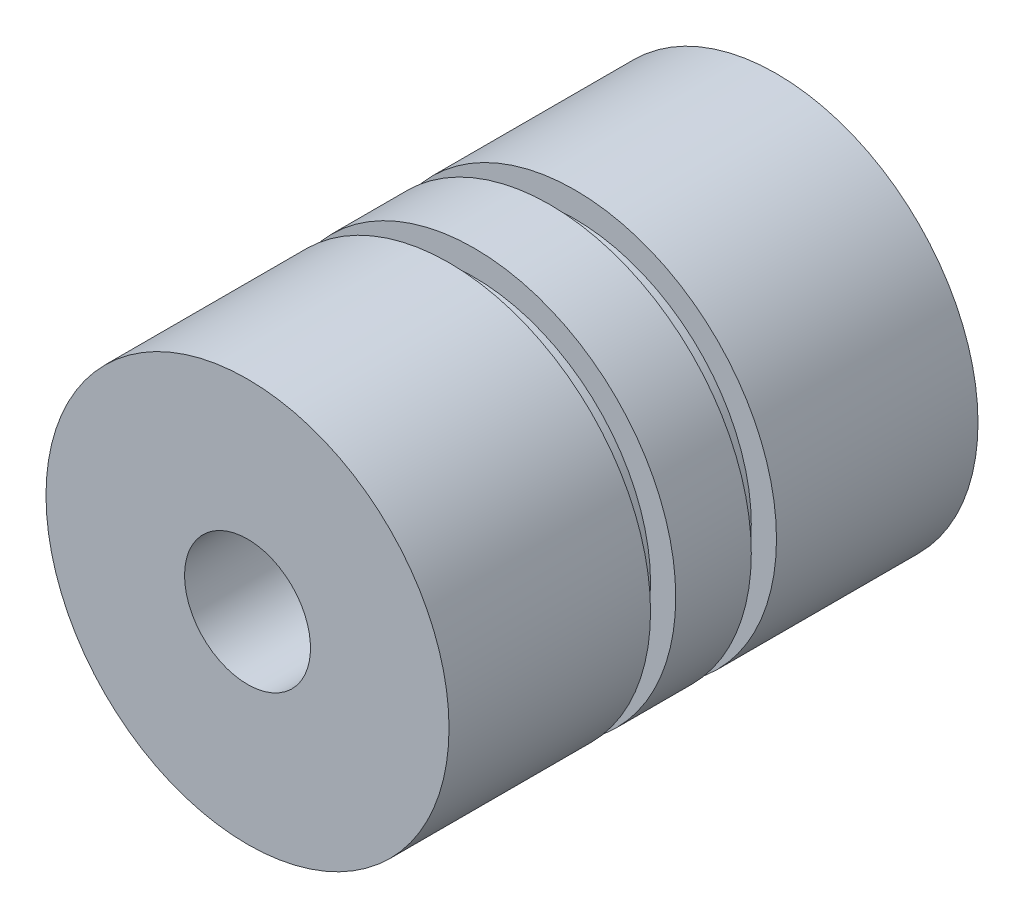
ISO-10303-21;
HEADER;
FILE_DESCRIPTION(('STEP AP214'),'2;1');
FILE_NAME('part.step','',(''),(''),'','','');
FILE_SCHEMA(('AUTOMOTIVE_DESIGN { 1 0 10303 214 1 1 1 1 }'));
ENDSEC;
DATA;
#1=APPLICATION_CONTEXT('core data for automotive mechanical design processes');
#2=APPLICATION_PROTOCOL_DEFINITION('international standard','automotive_design',2000,#1);
#3=PRODUCT_CONTEXT('',#1,'mechanical');
#4=PRODUCT('Part','Part','',(#3));
#5=PRODUCT_RELATED_PRODUCT_CATEGORY('part','',(#4));
#6=PRODUCT_DEFINITION_FORMATION('','',#4);
#7=PRODUCT_DEFINITION_CONTEXT('part definition',#1,'design');
#8=PRODUCT_DEFINITION('design','',#6,#7);
#9=PRODUCT_DEFINITION_SHAPE('','',#8);
#10=(LENGTH_UNIT() NAMED_UNIT(*) SI_UNIT(.MILLI.,.METRE.));
#11=(NAMED_UNIT(*) PLANE_ANGLE_UNIT() SI_UNIT($,.RADIAN.));
#12=(NAMED_UNIT(*) SI_UNIT($,.STERADIAN.) SOLID_ANGLE_UNIT());
#13=UNCERTAINTY_MEASURE_WITH_UNIT(LENGTH_MEASURE(1.E-05),#10,'distance_accuracy_value','');
#14=(GEOMETRIC_REPRESENTATION_CONTEXT(3) GLOBAL_UNCERTAINTY_ASSIGNED_CONTEXT((#13)) GLOBAL_UNIT_ASSIGNED_CONTEXT((#10,
#11,#12)) REPRESENTATION_CONTEXT('',''));
#15=CARTESIAN_POINT('',(0.,0.,0.));
#16=DIRECTION('',(0.,0.,1.));
#17=DIRECTION('',(1.,0.,0.));
#18=AXIS2_PLACEMENT_3D('',#15,#16,#17);
#19=CARTESIAN_POINT('',(0.,0.,21.));
#20=DIRECTION('',(0.,0.,-1.));
#21=DIRECTION('',(-1.,0.,0.));
#22=AXIS2_PLACEMENT_3D('',#19,#20,#21);
#23=CYLINDRICAL_SURFACE('',#22,16.);
#24=CARTESIAN_POINT('',(0.,0.,-21.));
#25=DIRECTION('',(0.,0.,1.));
#26=DIRECTION('',(1.,0.,0.));
#27=AXIS2_PLACEMENT_3D('',#24,#25,#26);
#28=CIRCLE('',#27,16.);
#29=CARTESIAN_POINT('',(-16.,0.,-21.));
#30=VERTEX_POINT('',#29);
#31=EDGE_CURVE('E39',#30,#30,#28,.T.);
#32=CARTESIAN_POINT('',(0.,0.,-5.));
#33=DIRECTION('',(0.,0.,1.));
#34=DIRECTION('',(1.,0.,0.));
#35=AXIS2_PLACEMENT_3D('',#32,#33,#34);
#36=CIRCLE('',#35,16.);
#37=CARTESIAN_POINT('',(-16.,0.,-5.));
#38=VERTEX_POINT('',#37);
#39=EDGE_CURVE('E64',#38,#38,#36,.T.);
#40=CARTESIAN_POINT('',(-16.,0.,-21.));
#41=CARTESIAN_POINT('',(-16.,0.,-20.8333333333333));
#42=CARTESIAN_POINT('',(-16.,0.,-20.6666666666667));
#43=CARTESIAN_POINT('',(-16.,0.,-20.3333333333333));
#44=CARTESIAN_POINT('',(-16.,0.,-20.1666666666667));
#45=CARTESIAN_POINT('',(-16.,0.,-19.8333333333333));
#46=CARTESIAN_POINT('',(-16.,0.,-19.6666666666667));
#47=CARTESIAN_POINT('',(-16.,0.,-19.3333333333333));
#48=CARTESIAN_POINT('',(-16.,0.,-19.1666666666667));
#49=CARTESIAN_POINT('',(-16.,0.,-18.8333333333333));
#50=CARTESIAN_POINT('',(-16.,0.,-18.6666666666667));
#51=CARTESIAN_POINT('',(-16.,0.,-18.3333333333333));
#52=CARTESIAN_POINT('',(-16.,0.,-18.1666666666667));
#53=CARTESIAN_POINT('',(-16.,0.,-17.8333333333333));
#54=CARTESIAN_POINT('',(-16.,0.,-17.6666666666667));
#55=CARTESIAN_POINT('',(-16.,0.,-17.3333333333333));
#56=CARTESIAN_POINT('',(-16.,0.,-17.1666666666667));
#57=CARTESIAN_POINT('',(-16.,0.,-16.8333333333333));
#58=CARTESIAN_POINT('',(-16.,0.,-16.6666666666667));
#59=CARTESIAN_POINT('',(-16.,0.,-16.3333333333333));
#60=CARTESIAN_POINT('',(-16.,0.,-16.1666666666667));
#61=CARTESIAN_POINT('',(-16.,0.,-15.8333333333333));
#62=CARTESIAN_POINT('',(-16.,0.,-15.6666666666667));
#63=CARTESIAN_POINT('',(-16.,0.,-15.3333333333333));
#64=CARTESIAN_POINT('',(-16.,0.,-15.1666666666667));
#65=CARTESIAN_POINT('',(-16.,0.,-14.8333333333333));
#66=CARTESIAN_POINT('',(-16.,0.,-14.6666666666667));
#67=CARTESIAN_POINT('',(-16.,0.,-14.3333333333333));
#68=CARTESIAN_POINT('',(-16.,0.,-14.1666666666667));
#69=CARTESIAN_POINT('',(-16.,0.,-13.8333333333333));
#70=CARTESIAN_POINT('',(-16.,0.,-13.6666666666667));
#71=CARTESIAN_POINT('',(-16.,0.,-13.3333333333333));
#72=CARTESIAN_POINT('',(-16.,0.,-13.1666666666667));
#73=CARTESIAN_POINT('',(-16.,0.,-12.8333333333333));
#74=CARTESIAN_POINT('',(-16.,0.,-12.6666666666667));
#75=CARTESIAN_POINT('',(-16.,0.,-12.3333333333333));
#76=CARTESIAN_POINT('',(-16.,0.,-12.1666666666667));
#77=CARTESIAN_POINT('',(-16.,0.,-11.8333333333333));
#78=CARTESIAN_POINT('',(-16.,0.,-11.6666666666667));
#79=CARTESIAN_POINT('',(-16.,0.,-11.3333333333333));
#80=CARTESIAN_POINT('',(-16.,0.,-11.1666666666667));
#81=CARTESIAN_POINT('',(-16.,0.,-10.8333333333333));
#82=CARTESIAN_POINT('',(-16.,0.,-10.6666666666667));
#83=CARTESIAN_POINT('',(-16.,0.,-10.3333333333333));
#84=CARTESIAN_POINT('',(-16.,0.,-10.1666666666667));
#85=CARTESIAN_POINT('',(-16.,0.,-9.83333333333333));
#86=CARTESIAN_POINT('',(-16.,0.,-9.66666666666667));
#87=CARTESIAN_POINT('',(-16.,0.,-9.33333333333333));
#88=CARTESIAN_POINT('',(-16.,0.,-9.16666666666667));
#89=CARTESIAN_POINT('',(-16.,0.,-8.83333333333333));
#90=CARTESIAN_POINT('',(-16.,0.,-8.66666666666667));
#91=CARTESIAN_POINT('',(-16.,0.,-8.33333333333333));
#92=CARTESIAN_POINT('',(-16.,0.,-8.16666666666667));
#93=CARTESIAN_POINT('',(-16.,0.,-7.83333333333333));
#94=CARTESIAN_POINT('',(-16.,0.,-7.66666666666667));
#95=CARTESIAN_POINT('',(-16.,0.,-7.33333333333333));
#96=CARTESIAN_POINT('',(-16.,0.,-7.16666666666667));
#97=CARTESIAN_POINT('',(-16.,0.,-6.83333333333333));
#98=CARTESIAN_POINT('',(-16.,0.,-6.66666666666667));
#99=CARTESIAN_POINT('',(-16.,0.,-6.33333333333333));
#100=CARTESIAN_POINT('',(-16.,0.,-6.16666666666667));
#101=CARTESIAN_POINT('',(-16.,0.,-5.83333333333333));
#102=CARTESIAN_POINT('',(-16.,0.,-5.66666666666666));
#103=CARTESIAN_POINT('',(-16.,0.,-5.33333333333333));
#104=CARTESIAN_POINT('',(-16.,0.,-5.16666666666666));
#105=CARTESIAN_POINT('',(-16.,0.,-5.));
#106=B_SPLINE_CURVE_WITH_KNOTS('',3,(#40,#41,#42,#43,#44,#45,#46,#47,#48,#49,#50,#51,#52,#53,
#54,#55,#56,#57,#58,#59,#60,#61,#62,#63,#64,#65,#66,#67,#68,#69,#70,#71,#72,#73,#74,#75,#76,#77,
#78,#79,#80,#81,#82,#83,#84,#85,#86,#87,#88,#89,#90,#91,#92,#93,#94,#95,#96,#97,#98,#99,#100,
#101,#102,#103,#104,#105),.UNSPECIFIED.,.F.,.F.,(4,2,2,2,2,2,2,2,2,2,2,2,2,2,2,2,2,2,2,2,2,2,2,
2,2,2,2,2,2,2,2,2,4),(0.,0.5,1.,1.5,2.,2.5,3.,3.5,4.,4.5,5.,5.50000000000001,6.00000000000001,
6.50000000000001,7.00000000000001,7.50000000000001,8.00000000000001,8.50000000000001,
9.00000000000001,9.50000000000001,10.,10.5,11.,11.5,12.,12.5,13.,13.5,14.,14.5,15.,15.5,16.),.UNSPECIFIED.);
#107=EDGE_CURVE('BSEAM31',#30,#38,#106,.T.);
#108=ORIENTED_EDGE('',*,*,#31,.T.);
#109=ORIENTED_EDGE('',*,*,#39,.F.);
#110=ORIENTED_EDGE('',*,*,#107,.T.);
#111=ORIENTED_EDGE('',*,*,#107,.F.);
#112=EDGE_LOOP('',(#108,#110,#109,#111));
#113=FACE_BOUND('',#112,.T.);
#114=ADVANCED_FACE('F31',(#113),#23,.T.);
#115=CARTESIAN_POINT('',(0.,0.,-3.));
#116=DIRECTION('',(0.,0.,1.));
#117=DIRECTION('',(1.,0.,0.));
#118=AXIS2_PLACEMENT_3D('',#115,#116,#117);
#119=CIRCLE('',#118,16.);
#120=CARTESIAN_POINT('',(-16.,0.,-3.));
#121=VERTEX_POINT('',#120);
#122=EDGE_CURVE('E67',#121,#121,#119,.T.);
#123=CARTESIAN_POINT('',(0.,0.,3.));
#124=DIRECTION('',(0.,0.,1.));
#125=DIRECTION('',(1.,0.,0.));
#126=AXIS2_PLACEMENT_3D('',#123,#124,#125);
#127=CIRCLE('',#126,16.);
#128=CARTESIAN_POINT('',(-16.,0.,3.));
#129=VERTEX_POINT('',#128);
#130=EDGE_CURVE('E52',#129,#129,#127,.T.);
#131=CARTESIAN_POINT('',(-16.,0.,-3.));
#132=CARTESIAN_POINT('',(-16.,0.,-2.9375));
#133=CARTESIAN_POINT('',(-16.,0.,-2.875));
#134=CARTESIAN_POINT('',(-16.,0.,-2.75));
#135=CARTESIAN_POINT('',(-16.,0.,-2.6875));
#136=CARTESIAN_POINT('',(-16.,0.,-2.5625));
#137=CARTESIAN_POINT('',(-16.,0.,-2.5));
#138=CARTESIAN_POINT('',(-16.,0.,-2.375));
#139=CARTESIAN_POINT('',(-16.,0.,-2.3125));
#140=CARTESIAN_POINT('',(-16.,0.,-2.1875));
#141=CARTESIAN_POINT('',(-16.,0.,-2.125));
#142=CARTESIAN_POINT('',(-16.,0.,-2.));
#143=CARTESIAN_POINT('',(-16.,0.,-1.9375));
#144=CARTESIAN_POINT('',(-16.,0.,-1.8125));
#145=CARTESIAN_POINT('',(-16.,0.,-1.75));
#146=CARTESIAN_POINT('',(-16.,0.,-1.625));
#147=CARTESIAN_POINT('',(-16.,0.,-1.5625));
#148=CARTESIAN_POINT('',(-16.,0.,-1.4375));
#149=CARTESIAN_POINT('',(-16.,0.,-1.375));
#150=CARTESIAN_POINT('',(-16.,0.,-1.25));
#151=CARTESIAN_POINT('',(-16.,0.,-1.1875));
#152=CARTESIAN_POINT('',(-16.,0.,-1.0625));
#153=CARTESIAN_POINT('',(-16.,0.,-1.));
#154=CARTESIAN_POINT('',(-16.,0.,-0.875000000000001));
#155=CARTESIAN_POINT('',(-16.,0.,-0.812500000000001));
#156=CARTESIAN_POINT('',(-16.,0.,-0.687500000000001));
#157=CARTESIAN_POINT('',(-16.,0.,-0.625000000000001));
#158=CARTESIAN_POINT('',(-16.,0.,-0.5));
#159=CARTESIAN_POINT('',(-16.,0.,-0.4375));
#160=CARTESIAN_POINT('',(-16.,0.,-0.3125));
#161=CARTESIAN_POINT('',(-16.,0.,-0.25));
#162=CARTESIAN_POINT('',(-16.,0.,-0.125));
#163=CARTESIAN_POINT('',(-16.,0.,-0.0625000000000001));
#164=CARTESIAN_POINT('',(-16.,0.,0.0625000000000001));
#165=CARTESIAN_POINT('',(-16.,0.,0.125));
#166=CARTESIAN_POINT('',(-16.,0.,0.25));
#167=CARTESIAN_POINT('',(-16.,0.,0.3125));
#168=CARTESIAN_POINT('',(-16.,0.,0.4375));
#169=CARTESIAN_POINT('',(-16.,0.,0.5));
#170=CARTESIAN_POINT('',(-16.,0.,0.625000000000001));
#171=CARTESIAN_POINT('',(-16.,0.,0.687500000000001));
#172=CARTESIAN_POINT('',(-16.,0.,0.812500000000001));
#173=CARTESIAN_POINT('',(-16.,0.,0.875000000000001));
#174=CARTESIAN_POINT('',(-16.,0.,1.));
#175=CARTESIAN_POINT('',(-16.,0.,1.0625));
#176=CARTESIAN_POINT('',(-16.,0.,1.1875));
#177=CARTESIAN_POINT('',(-16.,0.,1.25));
#178=CARTESIAN_POINT('',(-16.,0.,1.375));
#179=CARTESIAN_POINT('',(-16.,0.,1.4375));
#180=CARTESIAN_POINT('',(-16.,0.,1.5625));
#181=CARTESIAN_POINT('',(-16.,0.,1.625));
#182=CARTESIAN_POINT('',(-16.,0.,1.75));
#183=CARTESIAN_POINT('',(-16.,0.,1.8125));
#184=CARTESIAN_POINT('',(-16.,0.,1.9375));
#185=CARTESIAN_POINT('',(-16.,0.,2.));
#186=CARTESIAN_POINT('',(-16.,0.,2.125));
#187=CARTESIAN_POINT('',(-16.,0.,2.1875));
#188=CARTESIAN_POINT('',(-16.,0.,2.3125));
#189=CARTESIAN_POINT('',(-16.,0.,2.375));
#190=CARTESIAN_POINT('',(-16.,0.,2.5));
#191=CARTESIAN_POINT('',(-16.,0.,2.5625));
#192=CARTESIAN_POINT('',(-16.,0.,2.6875));
#193=CARTESIAN_POINT('',(-16.,0.,2.75));
#194=CARTESIAN_POINT('',(-16.,0.,2.875));
#195=CARTESIAN_POINT('',(-16.,0.,2.9375));
#196=CARTESIAN_POINT('',(-16.,0.,3.));
#197=B_SPLINE_CURVE_WITH_KNOTS('',3,(#131,#132,#133,#134,#135,#136,#137,#138,#139,#140,#141,
#142,#143,#144,#145,#146,#147,#148,#149,#150,#151,#152,#153,#154,#155,#156,#157,#158,#159,#160,
#161,#162,#163,#164,#165,#166,#167,#168,#169,#170,#171,#172,#173,#174,#175,#176,#177,#178,#179,
#180,#181,#182,#183,#184,#185,#186,#187,#188,#189,#190,#191,#192,#193,#194,#195,#196),
.UNSPECIFIED.,.F.,.F.,(4,2,2,2,2,2,2,2,2,2,2,2,2,2,2,2,2,2,2,2,2,2,2,2,2,2,2,2,2,2,2,2,4),(0.,
0.1875,0.375,0.5625,0.750000000000001,0.937500000000001,1.125,1.3125,1.5,1.6875,1.875,2.0625,
2.25,2.4375,2.625,2.8125,3.,3.1875,3.375,3.5625,3.75,3.9375,4.125,4.3125,4.5,4.6875,4.875,
5.0625,5.25,5.4375,5.62500000000001,5.81250000000001,6.00000000000001),.UNSPECIFIED.);
#198=EDGE_CURVE('BSEAM91',#121,#129,#197,.T.);
#199=ORIENTED_EDGE('',*,*,#122,.T.);
#200=ORIENTED_EDGE('',*,*,#130,.F.);
#201=ORIENTED_EDGE('',*,*,#198,.T.);
#202=ORIENTED_EDGE('',*,*,#198,.F.);
#203=EDGE_LOOP('',(#199,#201,#200,#202));
#204=FACE_BOUND('',#203,.T.);
#205=ADVANCED_FACE('F91',(#204),#23,.T.);
#206=CARTESIAN_POINT('',(0.,0.,21.));
#207=DIRECTION('',(0.,0.,-1.));
#208=DIRECTION('',(-1.,0.,0.));
#209=AXIS2_PLACEMENT_3D('',#206,#207,#208);
#210=CYLINDRICAL_SURFACE('',#209,5.);
#211=CARTESIAN_POINT('',(0.,0.,21.));
#212=DIRECTION('',(0.,0.,1.));
#213=DIRECTION('',(1.,0.,0.));
#214=AXIS2_PLACEMENT_3D('',#211,#212,#213);
#215=CIRCLE('',#214,5.);
#216=CARTESIAN_POINT('',(-5.,0.,21.));
#217=VERTEX_POINT('',#216);
#218=EDGE_CURVE('E44',#217,#217,#215,.T.);
#219=CARTESIAN_POINT('',(0.,0.,9.00000000000001));
#220=DIRECTION('',(0.,0.,-1.));
#221=DIRECTION('',(-1.,0.,0.));
#222=AXIS2_PLACEMENT_3D('',#219,#220,#221);
#223=CIRCLE('',#222,5.);
#224=CARTESIAN_POINT('',(-5.,0.,9.00000000000002));
#225=VERTEX_POINT('',#224);
#226=EDGE_CURVE('E35',#225,#225,#223,.T.);
#227=CARTESIAN_POINT('',(-5.,0.,21.));
#228=CARTESIAN_POINT('',(-5.,0.,20.875));
#229=CARTESIAN_POINT('',(-5.,0.,20.75));
#230=CARTESIAN_POINT('',(-5.,0.,20.5));
#231=CARTESIAN_POINT('',(-5.,0.,20.375));
#232=CARTESIAN_POINT('',(-5.,0.,20.125));
#233=CARTESIAN_POINT('',(-5.,0.,20.));
#234=CARTESIAN_POINT('',(-5.,0.,19.75));
#235=CARTESIAN_POINT('',(-5.,0.,19.625));
#236=CARTESIAN_POINT('',(-5.,0.,19.375));
#237=CARTESIAN_POINT('',(-5.,0.,19.25));
#238=CARTESIAN_POINT('',(-5.,0.,19.));
#239=CARTESIAN_POINT('',(-5.,0.,18.875));
#240=CARTESIAN_POINT('',(-5.,0.,18.625));
#241=CARTESIAN_POINT('',(-5.,0.,18.5));
#242=CARTESIAN_POINT('',(-5.,0.,18.25));
#243=CARTESIAN_POINT('',(-5.,0.,18.125));
#244=CARTESIAN_POINT('',(-5.,0.,17.875));
#245=CARTESIAN_POINT('',(-5.,0.,17.75));
#246=CARTESIAN_POINT('',(-5.,0.,17.5));
#247=CARTESIAN_POINT('',(-5.,0.,17.375));
#248=CARTESIAN_POINT('',(-5.,0.,17.125));
#249=CARTESIAN_POINT('',(-5.,0.,17.));
#250=CARTESIAN_POINT('',(-5.,0.,16.75));
#251=CARTESIAN_POINT('',(-5.,0.,16.625));
#252=CARTESIAN_POINT('',(-5.,0.,16.375));
#253=CARTESIAN_POINT('',(-5.,0.,16.25));
#254=CARTESIAN_POINT('',(-5.,0.,16.));
#255=CARTESIAN_POINT('',(-5.,0.,15.875));
#256=CARTESIAN_POINT('',(-5.,0.,15.625));
#257=CARTESIAN_POINT('',(-5.,0.,15.5));
#258=CARTESIAN_POINT('',(-5.,0.,15.25));
#259=CARTESIAN_POINT('',(-5.,0.,15.125));
#260=CARTESIAN_POINT('',(-5.,0.,14.875));
#261=CARTESIAN_POINT('',(-5.,0.,14.75));
#262=CARTESIAN_POINT('',(-5.,0.,14.5));
#263=CARTESIAN_POINT('',(-5.,0.,14.375));
#264=CARTESIAN_POINT('',(-5.,0.,14.125));
#265=CARTESIAN_POINT('',(-5.,0.,14.));
#266=CARTESIAN_POINT('',(-5.,0.,13.75));
#267=CARTESIAN_POINT('',(-5.,0.,13.625));
#268=CARTESIAN_POINT('',(-5.,0.,13.375));
#269=CARTESIAN_POINT('',(-5.,0.,13.25));
#270=CARTESIAN_POINT('',(-5.,0.,13.));
#271=CARTESIAN_POINT('',(-5.,0.,12.875));
#272=CARTESIAN_POINT('',(-5.,0.,12.625));
#273=CARTESIAN_POINT('',(-5.,0.,12.5));
#274=CARTESIAN_POINT('',(-5.,0.,12.25));
#275=CARTESIAN_POINT('',(-5.,0.,12.125));
#276=CARTESIAN_POINT('',(-5.,0.,11.875));
#277=CARTESIAN_POINT('',(-5.,0.,11.75));
#278=CARTESIAN_POINT('',(-5.,0.,11.5));
#279=CARTESIAN_POINT('',(-5.,0.,11.375));
#280=CARTESIAN_POINT('',(-5.,0.,11.125));
#281=CARTESIAN_POINT('',(-5.,0.,11.));
#282=CARTESIAN_POINT('',(-5.,0.,10.75));
#283=CARTESIAN_POINT('',(-5.,0.,10.625));
#284=CARTESIAN_POINT('',(-5.,0.,10.375));
#285=CARTESIAN_POINT('',(-5.,0.,10.25));
#286=CARTESIAN_POINT('',(-5.,0.,10.));
#287=CARTESIAN_POINT('',(-5.,0.,9.87500000000002));
#288=CARTESIAN_POINT('',(-5.,0.,9.62500000000002));
#289=CARTESIAN_POINT('',(-5.,0.,9.50000000000002));
#290=CARTESIAN_POINT('',(-5.,0.,9.25000000000002));
#291=CARTESIAN_POINT('',(-5.,0.,9.12500000000002));
#292=CARTESIAN_POINT('',(-5.,0.,9.00000000000002));
#293=B_SPLINE_CURVE_WITH_KNOTS('',3,(#227,#228,#229,#230,#231,#232,#233,#234,#235,#236,#237,
#238,#239,#240,#241,#242,#243,#244,#245,#246,#247,#248,#249,#250,#251,#252,#253,#254,#255,#256,
#257,#258,#259,#260,#261,#262,#263,#264,#265,#266,#267,#268,#269,#270,#271,#272,#273,#274,#275,
#276,#277,#278,#279,#280,#281,#282,#283,#284,#285,#286,#287,#288,#289,#290,#291,#292),
.UNSPECIFIED.,.F.,.F.,(4,2,2,2,2,2,2,2,2,2,2,2,2,2,2,2,2,2,2,2,2,2,2,2,2,2,2,2,2,2,2,2,4),(0.,
0.374999999999997,0.749999999999997,1.125,1.49999999999999,1.87499999999999,2.25,2.625,3.,
3.37499999999999,3.74999999999999,4.12499999999999,4.49999999999999,4.87499999999999,
5.24999999999999,5.62499999999999,5.99999999999999,6.37499999999999,6.74999999999999,
7.12499999999999,7.49999999999999,7.87499999999999,8.24999999999999,8.62499999999999,
8.99999999999999,9.37499999999998,9.74999999999998,10.125,10.5,10.875,11.25,11.625,12.),.UNSPECIFIED.);
#294=EDGE_CURVE('BSEAM96',#217,#225,#293,.T.);
#295=ORIENTED_EDGE('',*,*,#218,.T.);
#296=ORIENTED_EDGE('',*,*,#226,.T.);
#297=ORIENTED_EDGE('',*,*,#294,.T.);
#298=ORIENTED_EDGE('',*,*,#294,.F.);
#299=EDGE_LOOP('',(#295,#297,#296,#298));
#300=FACE_BOUND('',#299,.T.);
#301=ADVANCED_FACE('F96',(#300),#210,.F.);
#302=CARTESIAN_POINT('',(0.,0.,21.));
#303=DIRECTION('',(0.,0.,1.));
#304=DIRECTION('',(1.,0.,0.));
#305=AXIS2_PLACEMENT_3D('',#302,#303,#304);
#306=PLANE('',#305);
#307=CARTESIAN_POINT('',(0.,0.,21.));
#308=DIRECTION('',(0.,0.,1.));
#309=DIRECTION('',(1.,0.,0.));
#310=AXIS2_PLACEMENT_3D('',#307,#308,#309);
#311=CIRCLE('',#310,16.);
#312=CARTESIAN_POINT('',(-16.,0.,21.));
#313=VERTEX_POINT('',#312);
#314=EDGE_CURVE('E10',#313,#313,#311,.T.);
#315=ORIENTED_EDGE('',*,*,#314,.T.);
#316=EDGE_LOOP('',(#315));
#317=FACE_BOUND('',#316,.T.);
#318=ORIENTED_EDGE('',*,*,#218,.F.);
#319=EDGE_LOOP('',(#318));
#320=FACE_BOUND('',#319,.T.);
#321=ADVANCED_FACE('F109',(#317,#320),#306,.T.);
#322=CARTESIAN_POINT('',(0.,0.,-21.));
#323=DIRECTION('',(0.,0.,1.));
#324=DIRECTION('',(1.,0.,0.));
#325=AXIS2_PLACEMENT_3D('',#322,#323,#324);
#326=PLANE('',#325);
#327=CARTESIAN_POINT('',(0.,0.,-21.));
#328=DIRECTION('',(0.,0.,-1.));
#329=DIRECTION('',(-1.,0.,0.));
#330=AXIS2_PLACEMENT_3D('',#327,#328,#329);
#331=CIRCLE('',#330,7.);
#332=CARTESIAN_POINT('',(-7.,0.,-21.));
#333=VERTEX_POINT('',#332);
#334=EDGE_CURVE('E48',#333,#333,#331,.T.);
#335=ORIENTED_EDGE('',*,*,#334,.F.);
#336=EDGE_LOOP('',(#335));
#337=FACE_BOUND('',#336,.T.);
#338=ORIENTED_EDGE('',*,*,#31,.F.);
#339=EDGE_LOOP('',(#338));
#340=FACE_BOUND('',#339,.T.);
#341=ADVANCED_FACE('F100',(#337,#340),#326,.F.);
#342=CARTESIAN_POINT('',(0.,0.,5.));
#343=DIRECTION('',(0.,0.,1.));
#344=DIRECTION('',(1.,0.,0.));
#345=AXIS2_PLACEMENT_3D('',#342,#343,#344);
#346=CIRCLE('',#345,16.);
#347=CARTESIAN_POINT('',(-16.,0.,5.));
#348=VERTEX_POINT('',#347);
#349=EDGE_CURVE('E55',#348,#348,#346,.T.);
#350=CARTESIAN_POINT('',(-16.,0.,5.));
#351=CARTESIAN_POINT('',(-16.,0.,5.16666666666666));
#352=CARTESIAN_POINT('',(-16.,0.,5.33333333333333));
#353=CARTESIAN_POINT('',(-16.,0.,5.66666666666666));
#354=CARTESIAN_POINT('',(-16.,0.,5.83333333333333));
#355=CARTESIAN_POINT('',(-16.,0.,6.16666666666666));
#356=CARTESIAN_POINT('',(-16.,0.,6.33333333333333));
#357=CARTESIAN_POINT('',(-16.,0.,6.66666666666666));
#358=CARTESIAN_POINT('',(-16.,0.,6.83333333333333));
#359=CARTESIAN_POINT('',(-16.,0.,7.16666666666666));
#360=CARTESIAN_POINT('',(-16.,0.,7.33333333333333));
#361=CARTESIAN_POINT('',(-16.,0.,7.66666666666666));
#362=CARTESIAN_POINT('',(-16.,0.,7.83333333333333));
#363=CARTESIAN_POINT('',(-16.,0.,8.16666666666666));
#364=CARTESIAN_POINT('',(-16.,0.,8.33333333333333));
#365=CARTESIAN_POINT('',(-16.,0.,8.66666666666666));
#366=CARTESIAN_POINT('',(-16.,0.,8.83333333333333));
#367=CARTESIAN_POINT('',(-16.,0.,9.16666666666666));
#368=CARTESIAN_POINT('',(-16.,0.,9.33333333333333));
#369=CARTESIAN_POINT('',(-16.,0.,9.66666666666666));
#370=CARTESIAN_POINT('',(-16.,0.,9.83333333333333));
#371=CARTESIAN_POINT('',(-16.,0.,10.1666666666667));
#372=CARTESIAN_POINT('',(-16.,0.,10.3333333333333));
#373=CARTESIAN_POINT('',(-16.,0.,10.6666666666667));
#374=CARTESIAN_POINT('',(-16.,0.,10.8333333333333));
#375=CARTESIAN_POINT('',(-16.,0.,11.1666666666667));
#376=CARTESIAN_POINT('',(-16.,0.,11.3333333333333));
#377=CARTESIAN_POINT('',(-16.,0.,11.6666666666667));
#378=CARTESIAN_POINT('',(-16.,0.,11.8333333333333));
#379=CARTESIAN_POINT('',(-16.,0.,12.1666666666667));
#380=CARTESIAN_POINT('',(-16.,0.,12.3333333333333));
#381=CARTESIAN_POINT('',(-16.,0.,12.6666666666667));
#382=CARTESIAN_POINT('',(-16.,0.,12.8333333333333));
#383=CARTESIAN_POINT('',(-16.,0.,13.1666666666667));
#384=CARTESIAN_POINT('',(-16.,0.,13.3333333333333));
#385=CARTESIAN_POINT('',(-16.,0.,13.6666666666667));
#386=CARTESIAN_POINT('',(-16.,0.,13.8333333333333));
#387=CARTESIAN_POINT('',(-16.,0.,14.1666666666667));
#388=CARTESIAN_POINT('',(-16.,0.,14.3333333333333));
#389=CARTESIAN_POINT('',(-16.,0.,14.6666666666667));
#390=CARTESIAN_POINT('',(-16.,0.,14.8333333333333));
#391=CARTESIAN_POINT('',(-16.,0.,15.1666666666667));
#392=CARTESIAN_POINT('',(-16.,0.,15.3333333333333));
#393=CARTESIAN_POINT('',(-16.,0.,15.6666666666667));
#394=CARTESIAN_POINT('',(-16.,0.,15.8333333333333));
#395=CARTESIAN_POINT('',(-16.,0.,16.1666666666667));
#396=CARTESIAN_POINT('',(-16.,0.,16.3333333333333));
#397=CARTESIAN_POINT('',(-16.,0.,16.6666666666667));
#398=CARTESIAN_POINT('',(-16.,0.,16.8333333333333));
#399=CARTESIAN_POINT('',(-16.,0.,17.1666666666667));
#400=CARTESIAN_POINT('',(-16.,0.,17.3333333333333));
#401=CARTESIAN_POINT('',(-16.,0.,17.6666666666667));
#402=CARTESIAN_POINT('',(-16.,0.,17.8333333333333));
#403=CARTESIAN_POINT('',(-16.,0.,18.1666666666667));
#404=CARTESIAN_POINT('',(-16.,0.,18.3333333333333));
#405=CARTESIAN_POINT('',(-16.,0.,18.6666666666667));
#406=CARTESIAN_POINT('',(-16.,0.,18.8333333333333));
#407=CARTESIAN_POINT('',(-16.,0.,19.1666666666667));
#408=CARTESIAN_POINT('',(-16.,0.,19.3333333333333));
#409=CARTESIAN_POINT('',(-16.,0.,19.6666666666667));
#410=CARTESIAN_POINT('',(-16.,0.,19.8333333333333));
#411=CARTESIAN_POINT('',(-16.,0.,20.1666666666667));
#412=CARTESIAN_POINT('',(-16.,0.,20.3333333333333));
#413=CARTESIAN_POINT('',(-16.,0.,20.6666666666667));
#414=CARTESIAN_POINT('',(-16.,0.,20.8333333333333));
#415=CARTESIAN_POINT('',(-16.,0.,21.));
#416=B_SPLINE_CURVE_WITH_KNOTS('',3,(#350,#351,#352,#353,#354,#355,#356,#357,#358,#359,#360,
#361,#362,#363,#364,#365,#366,#367,#368,#369,#370,#371,#372,#373,#374,#375,#376,#377,#378,#379,
#380,#381,#382,#383,#384,#385,#386,#387,#388,#389,#390,#391,#392,#393,#394,#395,#396,#397,#398,
#399,#400,#401,#402,#403,#404,#405,#406,#407,#408,#409,#410,#411,#412,#413,#414,#415),
.UNSPECIFIED.,.F.,.F.,(4,2,2,2,2,2,2,2,2,2,2,2,2,2,2,2,2,2,2,2,2,2,2,2,2,2,2,2,2,2,2,2,4),(0.,
0.499999999999999,0.999999999999999,1.5,2.,2.5,3.,3.5,4.,4.5,5.,5.5,6.,6.5,7.,7.5,8.,8.5,9.,9.5,
10.,10.5,11.,11.5,12.,12.5,13.,13.5,14.,14.5,15.,15.5,16.),.UNSPECIFIED.);
#417=EDGE_CURVE('BSEAM33',#348,#313,#416,.T.);
#418=ORIENTED_EDGE('',*,*,#349,.T.);
#419=ORIENTED_EDGE('',*,*,#314,.F.);
#420=ORIENTED_EDGE('',*,*,#417,.T.);
#421=ORIENTED_EDGE('',*,*,#417,.F.);
#422=EDGE_LOOP('',(#418,#420,#419,#421));
#423=FACE_BOUND('',#422,.T.);
#424=ADVANCED_FACE('F33',(#423),#23,.T.);
#425=CARTESIAN_POINT('',(0.,0.,9.00000000000001));
#426=DIRECTION('',(0.,0.,-1.));
#427=DIRECTION('',(-1.,0.,0.));
#428=AXIS2_PLACEMENT_3D('',#425,#426,#427);
#429=CYLINDRICAL_SURFACE('',#428,7.);
#430=CARTESIAN_POINT('',(0.,0.,9.00000000000001));
#431=DIRECTION('',(0.,0.,-1.));
#432=DIRECTION('',(-1.,0.,0.));
#433=AXIS2_PLACEMENT_3D('',#430,#431,#432);
#434=CIRCLE('',#433,7.);
#435=CARTESIAN_POINT('',(-7.,0.,9.00000000000001));
#436=VERTEX_POINT('',#435);
#437=EDGE_CURVE('E51',#436,#436,#434,.T.);
#438=ORIENTED_EDGE('',*,*,#437,.F.);
#439=EDGE_LOOP('',(#438));
#440=FACE_BOUND('',#439,.T.);
#441=ORIENTED_EDGE('',*,*,#334,.T.);
#442=EDGE_LOOP('',(#441));
#443=FACE_BOUND('',#442,.T.);
#444=ADVANCED_FACE('F99',(#440,#443),#429,.F.);
#445=CARTESIAN_POINT('',(0.,0.,9.00000000000001));
#446=DIRECTION('',(0.,0.,-1.));
#447=DIRECTION('',(-1.,0.,0.));
#448=AXIS2_PLACEMENT_3D('',#445,#446,#447);
#449=PLANE('',#448);
#450=ORIENTED_EDGE('',*,*,#226,.F.);
#451=EDGE_LOOP('',(#450));
#452=FACE_BOUND('',#451,.T.);
#453=ORIENTED_EDGE('',*,*,#437,.T.);
#454=EDGE_LOOP('',(#453));
#455=FACE_BOUND('',#454,.T.);
#456=ADVANCED_FACE('F106',(#452,#455),#449,.T.);
#457=CARTESIAN_POINT('',(0.,0.,3.));
#458=DIRECTION('',(0.,0.,1.));
#459=DIRECTION('',(1.,0.,0.));
#460=AXIS2_PLACEMENT_3D('',#457,#458,#459);
#461=PLANE('',#460);
#462=CARTESIAN_POINT('',(0.,0.,3.));
#463=DIRECTION('',(0.,0.,1.));
#464=DIRECTION('',(1.,0.,0.));
#465=AXIS2_PLACEMENT_3D('',#462,#463,#464);
#466=CIRCLE('',#465,14.);
#467=CARTESIAN_POINT('',(14.,0.,3.));
#468=VERTEX_POINT('',#467);
#469=EDGE_CURVE('E58',#468,#468,#466,.T.);
#470=ORIENTED_EDGE('',*,*,#469,.F.);
#471=EDGE_LOOP('',(#470));
#472=FACE_BOUND('',#471,.T.);
#473=ORIENTED_EDGE('',*,*,#130,.T.);
#474=EDGE_LOOP('',(#473));
#475=FACE_BOUND('',#474,.T.);
#476=ADVANCED_FACE('F116',(#472,#475),#461,.T.);
#477=CARTESIAN_POINT('',(0.,0.,5.));
#478=DIRECTION('',(0.,0.,1.));
#479=DIRECTION('',(1.,0.,0.));
#480=AXIS2_PLACEMENT_3D('',#477,#478,#479);
#481=PLANE('',#480);
#482=CARTESIAN_POINT('',(0.,0.,5.));
#483=DIRECTION('',(0.,0.,1.));
#484=DIRECTION('',(1.,0.,0.));
#485=AXIS2_PLACEMENT_3D('',#482,#483,#484);
#486=CIRCLE('',#485,14.);
#487=CARTESIAN_POINT('',(14.,0.,5.));
#488=VERTEX_POINT('',#487);
#489=EDGE_CURVE('E61',#488,#488,#486,.T.);
#490=ORIENTED_EDGE('',*,*,#489,.T.);
#491=EDGE_LOOP('',(#490));
#492=FACE_BOUND('',#491,.T.);
#493=ORIENTED_EDGE('',*,*,#349,.F.);
#494=EDGE_LOOP('',(#493));
#495=FACE_BOUND('',#494,.T.);
#496=ADVANCED_FACE('F114',(#492,#495),#481,.F.);
#497=CARTESIAN_POINT('',(0.,0.,3.));
#498=DIRECTION('',(0.,0.,1.));
#499=DIRECTION('',(1.,0.,0.));
#500=AXIS2_PLACEMENT_3D('',#497,#498,#499);
#501=CYLINDRICAL_SURFACE('',#500,14.);
#502=ORIENTED_EDGE('',*,*,#469,.T.);
#503=EDGE_LOOP('',(#502));
#504=FACE_BOUND('',#503,.T.);
#505=ORIENTED_EDGE('',*,*,#489,.F.);
#506=EDGE_LOOP('',(#505));
#507=FACE_BOUND('',#506,.T.);
#508=ADVANCED_FACE('F86',(#504,#507),#501,.T.);
#509=CARTESIAN_POINT('',(0.,0.,-5.));
#510=DIRECTION('',(0.,0.,1.));
#511=DIRECTION('',(1.,0.,0.));
#512=AXIS2_PLACEMENT_3D('',#509,#510,#511);
#513=PLANE('',#512);
#514=CARTESIAN_POINT('',(0.,0.,-5.));
#515=DIRECTION('',(0.,0.,1.));
#516=DIRECTION('',(1.,0.,0.));
#517=AXIS2_PLACEMENT_3D('',#514,#515,#516);
#518=CIRCLE('',#517,14.);
#519=CARTESIAN_POINT('',(14.,0.,-5.));
#520=VERTEX_POINT('',#519);
#521=EDGE_CURVE('E70',#520,#520,#518,.T.);
#522=ORIENTED_EDGE('',*,*,#521,.F.);
#523=EDGE_LOOP('',(#522));
#524=FACE_BOUND('',#523,.T.);
#525=ORIENTED_EDGE('',*,*,#39,.T.);
#526=EDGE_LOOP('',(#525));
#527=FACE_BOUND('',#526,.T.);
#528=ADVANCED_FACE('F82',(#524,#527),#513,.T.);
#529=CARTESIAN_POINT('',(0.,0.,-3.));
#530=DIRECTION('',(0.,0.,1.));
#531=DIRECTION('',(1.,0.,0.));
#532=AXIS2_PLACEMENT_3D('',#529,#530,#531);
#533=PLANE('',#532);
#534=CARTESIAN_POINT('',(0.,0.,-3.));
#535=DIRECTION('',(0.,0.,1.));
#536=DIRECTION('',(1.,0.,0.));
#537=AXIS2_PLACEMENT_3D('',#534,#535,#536);
#538=CIRCLE('',#537,14.);
#539=CARTESIAN_POINT('',(14.,0.,-3.));
#540=VERTEX_POINT('',#539);
#541=EDGE_CURVE('E73',#540,#540,#538,.T.);
#542=ORIENTED_EDGE('',*,*,#541,.T.);
#543=EDGE_LOOP('',(#542));
#544=FACE_BOUND('',#543,.T.);
#545=ORIENTED_EDGE('',*,*,#122,.F.);
#546=EDGE_LOOP('',(#545));
#547=FACE_BOUND('',#546,.T.);
#548=ADVANCED_FACE('F85',(#544,#547),#533,.F.);
#549=CARTESIAN_POINT('',(0.,0.,-5.));
#550=DIRECTION('',(0.,0.,1.));
#551=DIRECTION('',(1.,0.,0.));
#552=AXIS2_PLACEMENT_3D('',#549,#550,#551);
#553=CYLINDRICAL_SURFACE('',#552,14.);
#554=ORIENTED_EDGE('',*,*,#521,.T.);
#555=EDGE_LOOP('',(#554));
#556=FACE_BOUND('',#555,.T.);
#557=ORIENTED_EDGE('',*,*,#541,.F.);
#558=EDGE_LOOP('',(#557));
#559=FACE_BOUND('',#558,.T.);
#560=ADVANCED_FACE('F79',(#556,#559),#553,.T.);
#561=CLOSED_SHELL('',(#114,#205,#301,#321,#341,#424,#444,#456,#476,#496,#508,#528,#548,#560));
#562=MANIFOLD_SOLID_BREP('B2',#561);
#563=ADVANCED_BREP_SHAPE_REPRESENTATION('',(#18,#562),#14);
#564=SHAPE_DEFINITION_REPRESENTATION(#9,#563);
ENDSEC;
END-ISO-10303-21;
